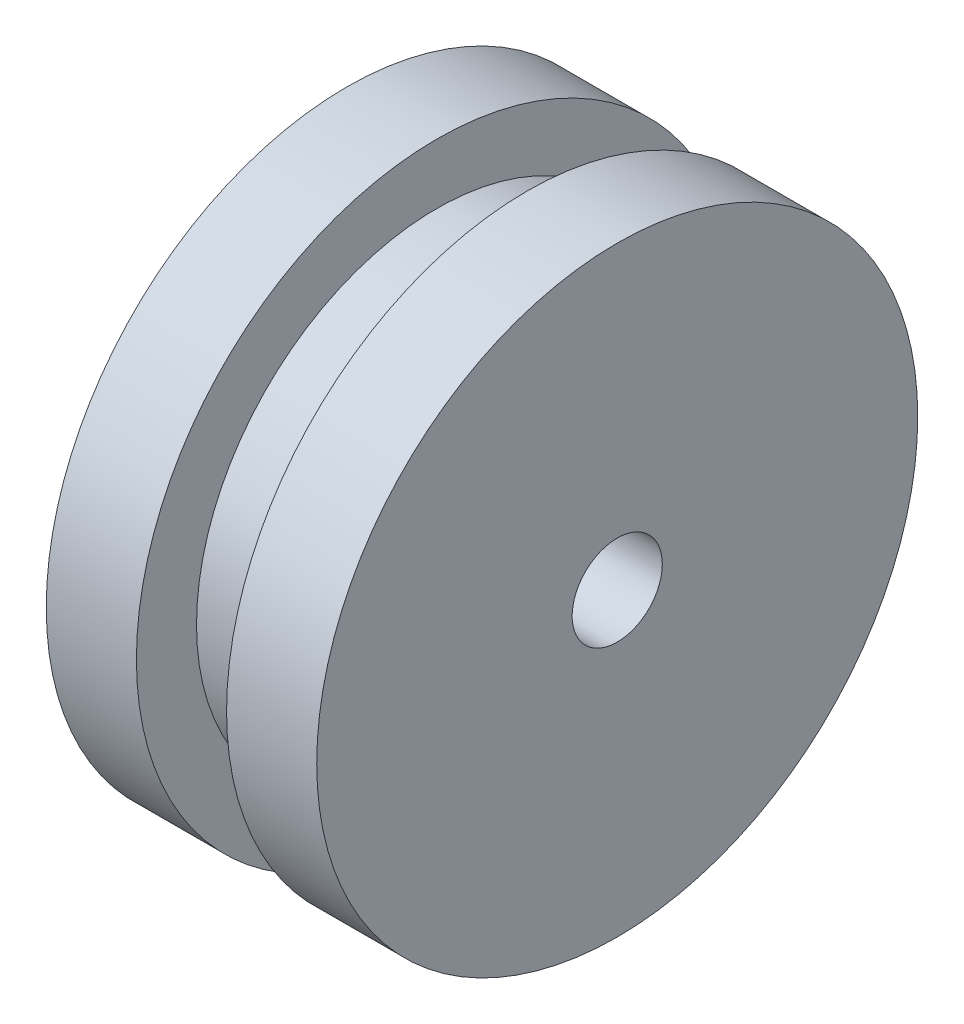
ISO-10303-21;
HEADER;
FILE_DESCRIPTION(('STEP AP214'),'2;1');
FILE_NAME('part.step','',(''),(''),'','','');
FILE_SCHEMA(('AUTOMOTIVE_DESIGN { 1 0 10303 214 1 1 1 1 }'));
ENDSEC;
DATA;
#1=APPLICATION_CONTEXT('core data for automotive mechanical design processes');
#2=APPLICATION_PROTOCOL_DEFINITION('international standard','automotive_design',2000,#1);
#3=PRODUCT_CONTEXT('',#1,'mechanical');
#4=PRODUCT('Part','Part','',(#3));
#5=PRODUCT_RELATED_PRODUCT_CATEGORY('part','',(#4));
#6=PRODUCT_DEFINITION_FORMATION('','',#4);
#7=PRODUCT_DEFINITION_CONTEXT('part definition',#1,'design');
#8=PRODUCT_DEFINITION('design','',#6,#7);
#9=PRODUCT_DEFINITION_SHAPE('','',#8);
#10=(LENGTH_UNIT() NAMED_UNIT(*) SI_UNIT(.MILLI.,.METRE.));
#11=(NAMED_UNIT(*) PLANE_ANGLE_UNIT() SI_UNIT($,.RADIAN.));
#12=(NAMED_UNIT(*) SI_UNIT($,.STERADIAN.) SOLID_ANGLE_UNIT());
#13=UNCERTAINTY_MEASURE_WITH_UNIT(LENGTH_MEASURE(1.E-05),#10,'distance_accuracy_value','');
#14=(GEOMETRIC_REPRESENTATION_CONTEXT(3) GLOBAL_UNCERTAINTY_ASSIGNED_CONTEXT((#13)) GLOBAL_UNIT_ASSIGNED_CONTEXT((#10,
#11,#12)) REPRESENTATION_CONTEXT('',''));
#15=CARTESIAN_POINT('',(0.,0.,0.));
#16=DIRECTION('',(0.,0.,1.));
#17=DIRECTION('',(1.,0.,0.));
#18=AXIS2_PLACEMENT_3D('',#15,#16,#17);
#19=CARTESIAN_POINT('',(14.2875,0.,0.));
#20=DIRECTION('',(-1.,0.,0.));
#21=DIRECTION('',(0.,0.,1.));
#22=AXIS2_PLACEMENT_3D('',#19,#20,#21);
#23=CYLINDRICAL_SURFACE('',#22,15.875);
#24=CARTESIAN_POINT('',(14.2875,0.,0.));
#25=DIRECTION('',(1.,0.,0.));
#26=DIRECTION('',(0.,0.,-1.));
#27=AXIS2_PLACEMENT_3D('',#24,#25,#26);
#28=CIRCLE('',#27,15.875);
#29=CARTESIAN_POINT('',(14.2875,0.,15.875));
#30=VERTEX_POINT('',#29);
#31=EDGE_CURVE('E11',#30,#30,#28,.T.);
#32=CARTESIAN_POINT('',(9.525,0.,0.));
#33=DIRECTION('',(1.,0.,0.));
#34=DIRECTION('',(0.,0.,-1.));
#35=AXIS2_PLACEMENT_3D('',#32,#33,#34);
#36=CIRCLE('',#35,15.875);
#37=CARTESIAN_POINT('',(9.525,0.,15.875));
#38=VERTEX_POINT('',#37);
#39=EDGE_CURVE('E47',#38,#38,#36,.T.);
#40=CARTESIAN_POINT('',(14.2875,0.,15.875));
#41=CARTESIAN_POINT('',(14.237890625,0.,15.875));
#42=CARTESIAN_POINT('',(14.18828125,0.,15.875));
#43=CARTESIAN_POINT('',(14.0890625,0.,15.875));
#44=CARTESIAN_POINT('',(14.039453125,0.,15.875));
#45=CARTESIAN_POINT('',(13.940234375,0.,15.875));
#46=CARTESIAN_POINT('',(13.890625,0.,15.875));
#47=CARTESIAN_POINT('',(13.79140625,0.,15.875));
#48=CARTESIAN_POINT('',(13.741796875,0.,15.875));
#49=CARTESIAN_POINT('',(13.642578125,0.,15.875));
#50=CARTESIAN_POINT('',(13.59296875,0.,15.875));
#51=CARTESIAN_POINT('',(13.49375,0.,15.875));
#52=CARTESIAN_POINT('',(13.444140625,0.,15.875));
#53=CARTESIAN_POINT('',(13.344921875,0.,15.875));
#54=CARTESIAN_POINT('',(13.2953125,0.,15.875));
#55=CARTESIAN_POINT('',(13.19609375,0.,15.875));
#56=CARTESIAN_POINT('',(13.146484375,0.,15.875));
#57=CARTESIAN_POINT('',(13.047265625,0.,15.875));
#58=CARTESIAN_POINT('',(12.99765625,0.,15.875));
#59=CARTESIAN_POINT('',(12.8984375,0.,15.875));
#60=CARTESIAN_POINT('',(12.848828125,0.,15.875));
#61=CARTESIAN_POINT('',(12.749609375,0.,15.875));
#62=CARTESIAN_POINT('',(12.7,0.,15.875));
#63=CARTESIAN_POINT('',(12.60078125,0.,15.875));
#64=CARTESIAN_POINT('',(12.551171875,0.,15.875));
#65=CARTESIAN_POINT('',(12.451953125,0.,15.875));
#66=CARTESIAN_POINT('',(12.40234375,0.,15.875));
#67=CARTESIAN_POINT('',(12.303125,0.,15.875));
#68=CARTESIAN_POINT('',(12.253515625,0.,15.875));
#69=CARTESIAN_POINT('',(12.154296875,0.,15.875));
#70=CARTESIAN_POINT('',(12.1046875,0.,15.875));
#71=CARTESIAN_POINT('',(12.00546875,0.,15.875));
#72=CARTESIAN_POINT('',(11.955859375,0.,15.875));
#73=CARTESIAN_POINT('',(11.856640625,0.,15.875));
#74=CARTESIAN_POINT('',(11.80703125,0.,15.875));
#75=CARTESIAN_POINT('',(11.7078125,0.,15.875));
#76=CARTESIAN_POINT('',(11.658203125,0.,15.875));
#77=CARTESIAN_POINT('',(11.558984375,0.,15.875));
#78=CARTESIAN_POINT('',(11.509375,0.,15.875));
#79=CARTESIAN_POINT('',(11.41015625,0.,15.875));
#80=CARTESIAN_POINT('',(11.360546875,0.,15.875));
#81=CARTESIAN_POINT('',(11.261328125,0.,15.875));
#82=CARTESIAN_POINT('',(11.21171875,0.,15.875));
#83=CARTESIAN_POINT('',(11.1125,0.,15.875));
#84=CARTESIAN_POINT('',(11.062890625,0.,15.875));
#85=CARTESIAN_POINT('',(10.963671875,0.,15.875));
#86=CARTESIAN_POINT('',(10.9140625,0.,15.875));
#87=CARTESIAN_POINT('',(10.81484375,0.,15.875));
#88=CARTESIAN_POINT('',(10.765234375,0.,15.875));
#89=CARTESIAN_POINT('',(10.666015625,0.,15.875));
#90=CARTESIAN_POINT('',(10.61640625,0.,15.875));
#91=CARTESIAN_POINT('',(10.5171875,0.,15.875));
#92=CARTESIAN_POINT('',(10.467578125,0.,15.875));
#93=CARTESIAN_POINT('',(10.368359375,0.,15.875));
#94=CARTESIAN_POINT('',(10.31875,0.,15.875));
#95=CARTESIAN_POINT('',(10.21953125,0.,15.875));
#96=CARTESIAN_POINT('',(10.169921875,0.,15.875));
#97=CARTESIAN_POINT('',(10.070703125,0.,15.875));
#98=CARTESIAN_POINT('',(10.02109375,0.,15.875));
#99=CARTESIAN_POINT('',(9.921875,0.,15.875));
#100=CARTESIAN_POINT('',(9.872265625,0.,15.875));
#101=CARTESIAN_POINT('',(9.773046875,0.,15.875));
#102=CARTESIAN_POINT('',(9.7234375,0.,15.875));
#103=CARTESIAN_POINT('',(9.62421875,0.,15.875));
#104=CARTESIAN_POINT('',(9.574609375,0.,15.875));
#105=CARTESIAN_POINT('',(9.525,0.,15.875));
#106=B_SPLINE_CURVE_WITH_KNOTS('',3,(#40,#41,#42,#43,#44,#45,#46,#47,#48,#49,#50,#51,#52,#53,
#54,#55,#56,#57,#58,#59,#60,#61,#62,#63,#64,#65,#66,#67,#68,#69,#70,#71,#72,#73,#74,#75,#76,#77,
#78,#79,#80,#81,#82,#83,#84,#85,#86,#87,#88,#89,#90,#91,#92,#93,#94,#95,#96,#97,#98,#99,#100,
#101,#102,#103,#104,#105),.UNSPECIFIED.,.F.,.F.,(4,2,2,2,2,2,2,2,2,2,2,2,2,2,2,2,2,2,2,2,2,2,2,
2,2,2,2,2,2,2,2,2,4),(0.,0.148828125,0.29765625,0.446484375,0.5953125,0.744140625,
0.892968750000001,1.041796875,1.190625,1.339453125,1.48828125,1.637109375,1.7859375,1.934765625,
2.08359375,2.232421875,2.38125,2.530078125,2.67890625,2.827734375,2.9765625,3.125390625,
3.27421875,3.423046875,3.571875,3.720703125,3.86953125,4.018359375,4.1671875,4.316015625,
4.46484375,4.613671875,4.7625),.UNSPECIFIED.);
#107=EDGE_CURVE('BSEAM40',#30,#38,#106,.T.);
#108=ORIENTED_EDGE('',*,*,#31,.F.);
#109=ORIENTED_EDGE('',*,*,#39,.T.);
#110=ORIENTED_EDGE('',*,*,#107,.T.);
#111=ORIENTED_EDGE('',*,*,#107,.F.);
#112=EDGE_LOOP('',(#108,#110,#109,#111));
#113=FACE_BOUND('',#112,.T.);
#114=ADVANCED_FACE('F40',(#113),#23,.T.);
#115=CARTESIAN_POINT('',(14.2875,0.,0.));
#116=DIRECTION('',(1.,0.,0.));
#117=DIRECTION('',(0.,0.,-1.));
#118=AXIS2_PLACEMENT_3D('',#115,#116,#117);
#119=PLANE('',#118);
#120=CARTESIAN_POINT('',(14.2875,0.,0.));
#121=DIRECTION('',(1.,0.,0.));
#122=DIRECTION('',(0.,0.,-1.));
#123=AXIS2_PLACEMENT_3D('',#120,#121,#122);
#124=CIRCLE('',#123,2.38125);
#125=CARTESIAN_POINT('',(14.2875,0.,-2.38125));
#126=VERTEX_POINT('',#125);
#127=EDGE_CURVE('E53',#126,#126,#124,.T.);
#128=ORIENTED_EDGE('',*,*,#127,.F.);
#129=EDGE_LOOP('',(#128));
#130=FACE_BOUND('',#129,.T.);
#131=ORIENTED_EDGE('',*,*,#31,.T.);
#132=EDGE_LOOP('',(#131));
#133=FACE_BOUND('',#132,.T.);
#134=ADVANCED_FACE('F69',(#130,#133),#119,.T.);
#135=CARTESIAN_POINT('',(9.525,0.,0.));
#136=DIRECTION('',(1.,0.,0.));
#137=DIRECTION('',(0.,0.,-1.));
#138=AXIS2_PLACEMENT_3D('',#135,#136,#137);
#139=PLANE('',#138);
#140=CARTESIAN_POINT('',(9.525,0.,0.));
#141=DIRECTION('',(1.,0.,0.));
#142=DIRECTION('',(0.,0.,-1.));
#143=AXIS2_PLACEMENT_3D('',#140,#141,#142);
#144=CIRCLE('',#143,2.38125);
#145=CARTESIAN_POINT('',(9.525,0.,-2.38125));
#146=VERTEX_POINT('',#145);
#147=EDGE_CURVE('E43',#146,#146,#144,.T.);
#148=ORIENTED_EDGE('',*,*,#147,.T.);
#149=EDGE_LOOP('',(#148));
#150=FACE_BOUND('',#149,.T.);
#151=ORIENTED_EDGE('',*,*,#39,.F.);
#152=EDGE_LOOP('',(#151));
#153=FACE_BOUND('',#152,.T.);
#154=ADVANCED_FACE('F60',(#150,#153),#139,.F.);
#155=CARTESIAN_POINT('',(0.,0.,0.));
#156=DIRECTION('',(1.,0.,0.));
#157=DIRECTION('',(0.,0.,-1.));
#158=AXIS2_PLACEMENT_3D('',#155,#156,#157);
#159=CYLINDRICAL_SURFACE('',#158,2.38125);
#160=CARTESIAN_POINT('',(14.2875,0.,-2.38125));
#161=CARTESIAN_POINT('',(14.237890625,0.,-2.38125));
#162=CARTESIAN_POINT('',(14.18828125,0.,-2.38125));
#163=CARTESIAN_POINT('',(14.0890625,0.,-2.38125));
#164=CARTESIAN_POINT('',(14.039453125,0.,-2.38125));
#165=CARTESIAN_POINT('',(13.940234375,0.,-2.38125));
#166=CARTESIAN_POINT('',(13.890625,0.,-2.38125));
#167=CARTESIAN_POINT('',(13.79140625,0.,-2.38125));
#168=CARTESIAN_POINT('',(13.741796875,0.,-2.38125));
#169=CARTESIAN_POINT('',(13.642578125,0.,-2.38125));
#170=CARTESIAN_POINT('',(13.59296875,0.,-2.38125));
#171=CARTESIAN_POINT('',(13.49375,0.,-2.38125));
#172=CARTESIAN_POINT('',(13.444140625,0.,-2.38125));
#173=CARTESIAN_POINT('',(13.344921875,0.,-2.38125));
#174=CARTESIAN_POINT('',(13.2953125,0.,-2.38125));
#175=CARTESIAN_POINT('',(13.19609375,0.,-2.38125));
#176=CARTESIAN_POINT('',(13.146484375,0.,-2.38125));
#177=CARTESIAN_POINT('',(13.047265625,0.,-2.38125));
#178=CARTESIAN_POINT('',(12.99765625,0.,-2.38125));
#179=CARTESIAN_POINT('',(12.8984375,0.,-2.38125));
#180=CARTESIAN_POINT('',(12.848828125,0.,-2.38125));
#181=CARTESIAN_POINT('',(12.749609375,0.,-2.38125));
#182=CARTESIAN_POINT('',(12.7,0.,-2.38125));
#183=CARTESIAN_POINT('',(12.60078125,0.,-2.38125));
#184=CARTESIAN_POINT('',(12.551171875,0.,-2.38125));
#185=CARTESIAN_POINT('',(12.451953125,0.,-2.38125));
#186=CARTESIAN_POINT('',(12.40234375,0.,-2.38125));
#187=CARTESIAN_POINT('',(12.303125,0.,-2.38125));
#188=CARTESIAN_POINT('',(12.253515625,0.,-2.38125));
#189=CARTESIAN_POINT('',(12.154296875,0.,-2.38125));
#190=CARTESIAN_POINT('',(12.1046875,0.,-2.38125));
#191=CARTESIAN_POINT('',(12.00546875,0.,-2.38125));
#192=CARTESIAN_POINT('',(11.955859375,0.,-2.38125));
#193=CARTESIAN_POINT('',(11.856640625,0.,-2.38125));
#194=CARTESIAN_POINT('',(11.80703125,0.,-2.38125));
#195=CARTESIAN_POINT('',(11.7078125,0.,-2.38125));
#196=CARTESIAN_POINT('',(11.658203125,0.,-2.38125));
#197=CARTESIAN_POINT('',(11.558984375,0.,-2.38125));
#198=CARTESIAN_POINT('',(11.509375,0.,-2.38125));
#199=CARTESIAN_POINT('',(11.41015625,0.,-2.38125));
#200=CARTESIAN_POINT('',(11.360546875,0.,-2.38125));
#201=CARTESIAN_POINT('',(11.261328125,0.,-2.38125));
#202=CARTESIAN_POINT('',(11.21171875,0.,-2.38125));
#203=CARTESIAN_POINT('',(11.1125,0.,-2.38125));
#204=CARTESIAN_POINT('',(11.062890625,0.,-2.38125));
#205=CARTESIAN_POINT('',(10.963671875,0.,-2.38125));
#206=CARTESIAN_POINT('',(10.9140625,0.,-2.38125));
#207=CARTESIAN_POINT('',(10.81484375,0.,-2.38125));
#208=CARTESIAN_POINT('',(10.765234375,0.,-2.38125));
#209=CARTESIAN_POINT('',(10.666015625,0.,-2.38125));
#210=CARTESIAN_POINT('',(10.61640625,0.,-2.38125));
#211=CARTESIAN_POINT('',(10.5171875,0.,-2.38125));
#212=CARTESIAN_POINT('',(10.467578125,0.,-2.38125));
#213=CARTESIAN_POINT('',(10.368359375,0.,-2.38125));
#214=CARTESIAN_POINT('',(10.31875,0.,-2.38125));
#215=CARTESIAN_POINT('',(10.21953125,0.,-2.38125));
#216=CARTESIAN_POINT('',(10.169921875,0.,-2.38125));
#217=CARTESIAN_POINT('',(10.070703125,0.,-2.38125));
#218=CARTESIAN_POINT('',(10.02109375,0.,-2.38125));
#219=CARTESIAN_POINT('',(9.921875,0.,-2.38125));
#220=CARTESIAN_POINT('',(9.872265625,0.,-2.38125));
#221=CARTESIAN_POINT('',(9.773046875,0.,-2.38125));
#222=CARTESIAN_POINT('',(9.7234375,0.,-2.38125));
#223=CARTESIAN_POINT('',(9.62421875,0.,-2.38125));
#224=CARTESIAN_POINT('',(9.574609375,0.,-2.38125));
#225=CARTESIAN_POINT('',(9.525,0.,-2.38125));
#226=B_SPLINE_CURVE_WITH_KNOTS('',3,(#160,#161,#162,#163,#164,#165,#166,#167,#168,#169,#170,
#171,#172,#173,#174,#175,#176,#177,#178,#179,#180,#181,#182,#183,#184,#185,#186,#187,#188,#189,
#190,#191,#192,#193,#194,#195,#196,#197,#198,#199,#200,#201,#202,#203,#204,#205,#206,#207,#208,
#209,#210,#211,#212,#213,#214,#215,#216,#217,#218,#219,#220,#221,#222,#223,#224,#225),
.UNSPECIFIED.,.F.,.F.,(4,2,2,2,2,2,2,2,2,2,2,2,2,2,2,2,2,2,2,2,2,2,2,2,2,2,2,2,2,2,2,2,4),(0.,
0.148828125,0.29765625,0.446484375,0.5953125,0.744140625,0.892968750000001,1.041796875,1.190625,
1.339453125,1.48828125,1.637109375,1.7859375,1.934765625,2.08359375,2.232421875,2.38125,
2.530078125,2.67890625,2.827734375,2.9765625,3.125390625,3.27421875,3.423046875,3.571875,
3.720703125,3.86953125,4.018359375,4.1671875,4.316015625,4.46484375,4.613671875,4.7625),.UNSPECIFIED.);
#227=EDGE_CURVE('BSEAM63',#126,#146,#226,.T.);
#228=ORIENTED_EDGE('',*,*,#127,.T.);
#229=ORIENTED_EDGE('',*,*,#147,.F.);
#230=ORIENTED_EDGE('',*,*,#227,.T.);
#231=ORIENTED_EDGE('',*,*,#227,.F.);
#232=EDGE_LOOP('',(#228,#230,#229,#231));
#233=FACE_BOUND('',#232,.T.);
#234=ADVANCED_FACE('F63',(#233),#159,.F.);
#235=CLOSED_SHELL('',(#114,#134,#154,#234));
#236=MANIFOLD_SOLID_BREP('B2',#235);
#237=CARTESIAN_POINT('',(9.525,0.,0.));
#238=DIRECTION('',(-1.,0.,0.));
#239=DIRECTION('',(0.,0.,1.));
#240=AXIS2_PLACEMENT_3D('',#237,#238,#239);
#241=CYLINDRICAL_SURFACE('',#240,12.7);
#242=CARTESIAN_POINT('',(9.525,0.,0.));
#243=DIRECTION('',(1.,0.,0.));
#244=DIRECTION('',(0.,0.,-1.));
#245=AXIS2_PLACEMENT_3D('',#242,#243,#244);
#246=CIRCLE('',#245,12.7);
#247=CARTESIAN_POINT('',(9.525,0.,12.7));
#248=VERTEX_POINT('',#247);
#249=EDGE_CURVE('E39',#248,#248,#246,.T.);
#250=CARTESIAN_POINT('',(4.7625,0.,0.));
#251=DIRECTION('',(1.,0.,0.));
#252=DIRECTION('',(0.,0.,-1.));
#253=AXIS2_PLACEMENT_3D('',#250,#251,#252);
#254=CIRCLE('',#253,12.7);
#255=CARTESIAN_POINT('',(4.7625,0.,12.7));
#256=VERTEX_POINT('',#255);
#257=EDGE_CURVE('E116',#256,#256,#254,.T.);
#258=CARTESIAN_POINT('',(9.525,0.,12.7));
#259=CARTESIAN_POINT('',(9.475390625,0.,12.7));
#260=CARTESIAN_POINT('',(9.42578125,0.,12.7));
#261=CARTESIAN_POINT('',(9.3265625,0.,12.7));
#262=CARTESIAN_POINT('',(9.276953125,0.,12.7));
#263=CARTESIAN_POINT('',(9.177734375,0.,12.7));
#264=CARTESIAN_POINT('',(9.128125,0.,12.7));
#265=CARTESIAN_POINT('',(9.02890625,0.,12.7));
#266=CARTESIAN_POINT('',(8.979296875,0.,12.7));
#267=CARTESIAN_POINT('',(8.880078125,0.,12.7));
#268=CARTESIAN_POINT('',(8.83046875,0.,12.7));
#269=CARTESIAN_POINT('',(8.73125,0.,12.7));
#270=CARTESIAN_POINT('',(8.681640625,0.,12.7));
#271=CARTESIAN_POINT('',(8.582421875,0.,12.7));
#272=CARTESIAN_POINT('',(8.5328125,0.,12.7));
#273=CARTESIAN_POINT('',(8.43359375,0.,12.7));
#274=CARTESIAN_POINT('',(8.383984375,0.,12.7));
#275=CARTESIAN_POINT('',(8.284765625,0.,12.7));
#276=CARTESIAN_POINT('',(8.23515625,0.,12.7));
#277=CARTESIAN_POINT('',(8.1359375,0.,12.7));
#278=CARTESIAN_POINT('',(8.086328125,0.,12.7));
#279=CARTESIAN_POINT('',(7.987109375,0.,12.7));
#280=CARTESIAN_POINT('',(7.9375,0.,12.7));
#281=CARTESIAN_POINT('',(7.83828125,0.,12.7));
#282=CARTESIAN_POINT('',(7.788671875,0.,12.7));
#283=CARTESIAN_POINT('',(7.689453125,0.,12.7));
#284=CARTESIAN_POINT('',(7.63984375,0.,12.7));
#285=CARTESIAN_POINT('',(7.540625,0.,12.7));
#286=CARTESIAN_POINT('',(7.491015625,0.,12.7));
#287=CARTESIAN_POINT('',(7.391796875,0.,12.7));
#288=CARTESIAN_POINT('',(7.3421875,0.,12.7));
#289=CARTESIAN_POINT('',(7.24296875,0.,12.7));
#290=CARTESIAN_POINT('',(7.193359375,0.,12.7));
#291=CARTESIAN_POINT('',(7.094140625,0.,12.7));
#292=CARTESIAN_POINT('',(7.04453125,0.,12.7));
#293=CARTESIAN_POINT('',(6.9453125,0.,12.7));
#294=CARTESIAN_POINT('',(6.895703125,0.,12.7));
#295=CARTESIAN_POINT('',(6.796484375,0.,12.7));
#296=CARTESIAN_POINT('',(6.746875,0.,12.7));
#297=CARTESIAN_POINT('',(6.64765625,0.,12.7));
#298=CARTESIAN_POINT('',(6.598046875,0.,12.7));
#299=CARTESIAN_POINT('',(6.498828125,0.,12.7));
#300=CARTESIAN_POINT('',(6.44921875,0.,12.7));
#301=CARTESIAN_POINT('',(6.35,0.,12.7));
#302=CARTESIAN_POINT('',(6.300390625,0.,12.7));
#303=CARTESIAN_POINT('',(6.201171875,0.,12.7));
#304=CARTESIAN_POINT('',(6.1515625,0.,12.7));
#305=CARTESIAN_POINT('',(6.05234375,0.,12.7));
#306=CARTESIAN_POINT('',(6.002734375,0.,12.7));
#307=CARTESIAN_POINT('',(5.903515625,0.,12.7));
#308=CARTESIAN_POINT('',(5.85390625,0.,12.7));
#309=CARTESIAN_POINT('',(5.7546875,0.,12.7));
#310=CARTESIAN_POINT('',(5.705078125,0.,12.7));
#311=CARTESIAN_POINT('',(5.605859375,0.,12.7));
#312=CARTESIAN_POINT('',(5.55625,0.,12.7));
#313=CARTESIAN_POINT('',(5.45703125,0.,12.7));
#314=CARTESIAN_POINT('',(5.407421875,0.,12.7));
#315=CARTESIAN_POINT('',(5.308203125,0.,12.7));
#316=CARTESIAN_POINT('',(5.25859375,0.,12.7));
#317=CARTESIAN_POINT('',(5.159375,0.,12.7));
#318=CARTESIAN_POINT('',(5.109765625,0.,12.7));
#319=CARTESIAN_POINT('',(5.010546875,0.,12.7));
#320=CARTESIAN_POINT('',(4.9609375,0.,12.7));
#321=CARTESIAN_POINT('',(4.86171875,0.,12.7));
#322=CARTESIAN_POINT('',(4.812109375,0.,12.7));
#323=CARTESIAN_POINT('',(4.7625,0.,12.7));
#324=B_SPLINE_CURVE_WITH_KNOTS('',3,(#258,#259,#260,#261,#262,#263,#264,#265,#266,#267,#268,
#269,#270,#271,#272,#273,#274,#275,#276,#277,#278,#279,#280,#281,#282,#283,#284,#285,#286,#287,
#288,#289,#290,#291,#292,#293,#294,#295,#296,#297,#298,#299,#300,#301,#302,#303,#304,#305,#306,
#307,#308,#309,#310,#311,#312,#313,#314,#315,#316,#317,#318,#319,#320,#321,#322,#323),
.UNSPECIFIED.,.F.,.F.,(4,2,2,2,2,2,2,2,2,2,2,2,2,2,2,2,2,2,2,2,2,2,2,2,2,2,2,2,2,2,2,2,4),(0.,
0.148828124999998,0.297656249999998,0.446484374999999,0.595312499999999,0.744140624999999,
0.892968749999999,1.041796875,1.190625,1.339453125,1.48828125,1.637109375,1.7859375,1.934765625,
2.08359375,2.232421875,2.38125,2.530078125,2.67890625,2.827734375,2.9765625,3.125390625,
3.27421875,3.423046875,3.571875,3.720703125,3.86953125,4.018359375,4.1671875,4.316015625,
4.46484375,4.613671875,4.7625),.UNSPECIFIED.);
#325=EDGE_CURVE('BSEAM109',#248,#256,#324,.T.);
#326=ORIENTED_EDGE('',*,*,#249,.F.);
#327=ORIENTED_EDGE('',*,*,#257,.T.);
#328=ORIENTED_EDGE('',*,*,#325,.T.);
#329=ORIENTED_EDGE('',*,*,#325,.F.);
#330=EDGE_LOOP('',(#326,#328,#327,#329));
#331=FACE_BOUND('',#330,.T.);
#332=ADVANCED_FACE('F109',(#331),#241,.T.);
#333=CARTESIAN_POINT('',(9.525,0.,0.));
#334=DIRECTION('',(1.,0.,0.));
#335=DIRECTION('',(0.,0.,-1.));
#336=AXIS2_PLACEMENT_3D('',#333,#334,#335);
#337=PLANE('',#336);
#338=CARTESIAN_POINT('',(9.525,0.,0.));
#339=DIRECTION('',(1.,0.,0.));
#340=DIRECTION('',(0.,0.,-1.));
#341=AXIS2_PLACEMENT_3D('',#338,#339,#340);
#342=CIRCLE('',#341,2.38125);
#343=CARTESIAN_POINT('',(9.525,0.,-2.38125));
#344=VERTEX_POINT('',#343);
#345=EDGE_CURVE('E121',#344,#344,#342,.T.);
#346=ORIENTED_EDGE('',*,*,#345,.F.);
#347=EDGE_LOOP('',(#346));
#348=FACE_BOUND('',#347,.T.);
#349=ORIENTED_EDGE('',*,*,#249,.T.);
#350=EDGE_LOOP('',(#349));
#351=FACE_BOUND('',#350,.T.);
#352=ADVANCED_FACE('F138',(#348,#351),#337,.T.);
#353=CARTESIAN_POINT('',(4.7625,0.,0.));
#354=DIRECTION('',(1.,0.,0.));
#355=DIRECTION('',(0.,0.,-1.));
#356=AXIS2_PLACEMENT_3D('',#353,#354,#355);
#357=PLANE('',#356);
#358=CARTESIAN_POINT('',(4.7625,0.,0.));
#359=DIRECTION('',(1.,0.,0.));
#360=DIRECTION('',(0.,0.,-1.));
#361=AXIS2_PLACEMENT_3D('',#358,#359,#360);
#362=CIRCLE('',#361,2.38125);
#363=CARTESIAN_POINT('',(4.7625,0.,-2.38125));
#364=VERTEX_POINT('',#363);
#365=EDGE_CURVE('E112',#364,#364,#362,.T.);
#366=ORIENTED_EDGE('',*,*,#365,.T.);
#367=EDGE_LOOP('',(#366));
#368=FACE_BOUND('',#367,.T.);
#369=ORIENTED_EDGE('',*,*,#257,.F.);
#370=EDGE_LOOP('',(#369));
#371=FACE_BOUND('',#370,.T.);
#372=ADVANCED_FACE('F129',(#368,#371),#357,.F.);
#373=CARTESIAN_POINT('',(0.,0.,0.));
#374=DIRECTION('',(1.,0.,0.));
#375=DIRECTION('',(0.,0.,-1.));
#376=AXIS2_PLACEMENT_3D('',#373,#374,#375);
#377=CYLINDRICAL_SURFACE('',#376,2.38125);
#378=CARTESIAN_POINT('',(9.525,0.,-2.38125));
#379=CARTESIAN_POINT('',(9.475390625,0.,-2.38125));
#380=CARTESIAN_POINT('',(9.42578125,0.,-2.38125));
#381=CARTESIAN_POINT('',(9.3265625,0.,-2.38125));
#382=CARTESIAN_POINT('',(9.276953125,0.,-2.38125));
#383=CARTESIAN_POINT('',(9.177734375,0.,-2.38125));
#384=CARTESIAN_POINT('',(9.128125,0.,-2.38125));
#385=CARTESIAN_POINT('',(9.02890625,0.,-2.38125));
#386=CARTESIAN_POINT('',(8.979296875,0.,-2.38125));
#387=CARTESIAN_POINT('',(8.880078125,0.,-2.38125));
#388=CARTESIAN_POINT('',(8.83046875,0.,-2.38125));
#389=CARTESIAN_POINT('',(8.73125,0.,-2.38125));
#390=CARTESIAN_POINT('',(8.681640625,0.,-2.38125));
#391=CARTESIAN_POINT('',(8.582421875,0.,-2.38125));
#392=CARTESIAN_POINT('',(8.5328125,0.,-2.38125));
#393=CARTESIAN_POINT('',(8.43359375,0.,-2.38125));
#394=CARTESIAN_POINT('',(8.383984375,0.,-2.38125));
#395=CARTESIAN_POINT('',(8.284765625,0.,-2.38125));
#396=CARTESIAN_POINT('',(8.23515625,0.,-2.38125));
#397=CARTESIAN_POINT('',(8.1359375,0.,-2.38125));
#398=CARTESIAN_POINT('',(8.086328125,0.,-2.38125));
#399=CARTESIAN_POINT('',(7.987109375,0.,-2.38125));
#400=CARTESIAN_POINT('',(7.9375,0.,-2.38125));
#401=CARTESIAN_POINT('',(7.83828125,0.,-2.38125));
#402=CARTESIAN_POINT('',(7.788671875,0.,-2.38125));
#403=CARTESIAN_POINT('',(7.689453125,0.,-2.38125));
#404=CARTESIAN_POINT('',(7.63984375,0.,-2.38125));
#405=CARTESIAN_POINT('',(7.540625,0.,-2.38125));
#406=CARTESIAN_POINT('',(7.491015625,0.,-2.38125));
#407=CARTESIAN_POINT('',(7.391796875,0.,-2.38125));
#408=CARTESIAN_POINT('',(7.3421875,0.,-2.38125));
#409=CARTESIAN_POINT('',(7.24296875,0.,-2.38125));
#410=CARTESIAN_POINT('',(7.193359375,0.,-2.38125));
#411=CARTESIAN_POINT('',(7.094140625,0.,-2.38125));
#412=CARTESIAN_POINT('',(7.04453125,0.,-2.38125));
#413=CARTESIAN_POINT('',(6.9453125,0.,-2.38125));
#414=CARTESIAN_POINT('',(6.895703125,0.,-2.38125));
#415=CARTESIAN_POINT('',(6.796484375,0.,-2.38125));
#416=CARTESIAN_POINT('',(6.746875,0.,-2.38125));
#417=CARTESIAN_POINT('',(6.64765625,0.,-2.38125));
#418=CARTESIAN_POINT('',(6.598046875,0.,-2.38125));
#419=CARTESIAN_POINT('',(6.498828125,0.,-2.38125));
#420=CARTESIAN_POINT('',(6.44921875,0.,-2.38125));
#421=CARTESIAN_POINT('',(6.35,0.,-2.38125));
#422=CARTESIAN_POINT('',(6.300390625,0.,-2.38125));
#423=CARTESIAN_POINT('',(6.201171875,0.,-2.38125));
#424=CARTESIAN_POINT('',(6.1515625,0.,-2.38125));
#425=CARTESIAN_POINT('',(6.05234375,0.,-2.38125));
#426=CARTESIAN_POINT('',(6.002734375,0.,-2.38125));
#427=CARTESIAN_POINT('',(5.903515625,0.,-2.38125));
#428=CARTESIAN_POINT('',(5.85390625,0.,-2.38125));
#429=CARTESIAN_POINT('',(5.7546875,0.,-2.38125));
#430=CARTESIAN_POINT('',(5.705078125,0.,-2.38125));
#431=CARTESIAN_POINT('',(5.605859375,0.,-2.38125));
#432=CARTESIAN_POINT('',(5.55625,0.,-2.38125));
#433=CARTESIAN_POINT('',(5.45703125,0.,-2.38125));
#434=CARTESIAN_POINT('',(5.407421875,0.,-2.38125));
#435=CARTESIAN_POINT('',(5.308203125,0.,-2.38125));
#436=CARTESIAN_POINT('',(5.25859375,0.,-2.38125));
#437=CARTESIAN_POINT('',(5.159375,0.,-2.38125));
#438=CARTESIAN_POINT('',(5.109765625,0.,-2.38125));
#439=CARTESIAN_POINT('',(5.010546875,0.,-2.38125));
#440=CARTESIAN_POINT('',(4.9609375,0.,-2.38125));
#441=CARTESIAN_POINT('',(4.86171875,0.,-2.38125));
#442=CARTESIAN_POINT('',(4.812109375,0.,-2.38125));
#443=CARTESIAN_POINT('',(4.7625,0.,-2.38125));
#444=B_SPLINE_CURVE_WITH_KNOTS('',3,(#378,#379,#380,#381,#382,#383,#384,#385,#386,#387,#388,
#389,#390,#391,#392,#393,#394,#395,#396,#397,#398,#399,#400,#401,#402,#403,#404,#405,#406,#407,
#408,#409,#410,#411,#412,#413,#414,#415,#416,#417,#418,#419,#420,#421,#422,#423,#424,#425,#426,
#427,#428,#429,#430,#431,#432,#433,#434,#435,#436,#437,#438,#439,#440,#441,#442,#443),
.UNSPECIFIED.,.F.,.F.,(4,2,2,2,2,2,2,2,2,2,2,2,2,2,2,2,2,2,2,2,2,2,2,2,2,2,2,2,2,2,2,2,4),(0.,
0.148828125,0.29765625,0.446484375,0.5953125,0.744140625,0.892968750000001,1.041796875,1.190625,
1.339453125,1.48828125,1.637109375,1.7859375,1.934765625,2.08359375,2.232421875,2.38125,
2.530078125,2.67890625,2.827734375,2.9765625,3.125390625,3.27421875,3.423046875,3.571875,
3.720703125,3.86953125,4.018359375,4.1671875,4.316015625,4.46484375,4.613671875,4.7625),.UNSPECIFIED.);
#445=EDGE_CURVE('BSEAM132',#344,#364,#444,.T.);
#446=ORIENTED_EDGE('',*,*,#345,.T.);
#447=ORIENTED_EDGE('',*,*,#365,.F.);
#448=ORIENTED_EDGE('',*,*,#445,.T.);
#449=ORIENTED_EDGE('',*,*,#445,.F.);
#450=EDGE_LOOP('',(#446,#448,#447,#449));
#451=FACE_BOUND('',#450,.T.);
#452=ADVANCED_FACE('F132',(#451),#377,.F.);
#453=CLOSED_SHELL('',(#332,#352,#372,#452));
#454=MANIFOLD_SOLID_BREP('B6',#453);
#455=CARTESIAN_POINT('',(4.7625,0.,0.));
#456=DIRECTION('',(-1.,0.,0.));
#457=DIRECTION('',(0.,0.,1.));
#458=AXIS2_PLACEMENT_3D('',#455,#456,#457);
#459=CYLINDRICAL_SURFACE('',#458,15.875);
#460=CARTESIAN_POINT('',(4.7625,0.,0.));
#461=DIRECTION('',(1.,0.,0.));
#462=DIRECTION('',(0.,0.,-1.));
#463=AXIS2_PLACEMENT_3D('',#460,#461,#462);
#464=CIRCLE('',#463,15.875);
#465=CARTESIAN_POINT('',(4.7625,0.,15.875));
#466=VERTEX_POINT('',#465);
#467=EDGE_CURVE('E108',#466,#466,#464,.T.);
#468=CARTESIAN_POINT('',(0.,0.,0.));
#469=DIRECTION('',(1.,0.,0.));
#470=DIRECTION('',(0.,0.,-1.));
#471=AXIS2_PLACEMENT_3D('',#468,#469,#470);
#472=CIRCLE('',#471,15.875);
#473=CARTESIAN_POINT('',(0.,0.,15.875));
#474=VERTEX_POINT('',#473);
#475=EDGE_CURVE('E174',#474,#474,#472,.T.);
#476=CARTESIAN_POINT('',(4.7625,0.,15.875));
#477=CARTESIAN_POINT('',(4.712890625,0.,15.875));
#478=CARTESIAN_POINT('',(4.66328125,0.,15.875));
#479=CARTESIAN_POINT('',(4.5640625,0.,15.875));
#480=CARTESIAN_POINT('',(4.514453125,0.,15.875));
#481=CARTESIAN_POINT('',(4.415234375,0.,15.875));
#482=CARTESIAN_POINT('',(4.365625,0.,15.875));
#483=CARTESIAN_POINT('',(4.26640625,0.,15.875));
#484=CARTESIAN_POINT('',(4.216796875,0.,15.875));
#485=CARTESIAN_POINT('',(4.117578125,0.,15.875));
#486=CARTESIAN_POINT('',(4.06796875,0.,15.875));
#487=CARTESIAN_POINT('',(3.96875,0.,15.875));
#488=CARTESIAN_POINT('',(3.919140625,0.,15.875));
#489=CARTESIAN_POINT('',(3.819921875,0.,15.875));
#490=CARTESIAN_POINT('',(3.7703125,0.,15.875));
#491=CARTESIAN_POINT('',(3.67109375,0.,15.875));
#492=CARTESIAN_POINT('',(3.621484375,0.,15.875));
#493=CARTESIAN_POINT('',(3.522265625,0.,15.875));
#494=CARTESIAN_POINT('',(3.47265625,0.,15.875));
#495=CARTESIAN_POINT('',(3.3734375,0.,15.875));
#496=CARTESIAN_POINT('',(3.323828125,0.,15.875));
#497=CARTESIAN_POINT('',(3.224609375,0.,15.875));
#498=CARTESIAN_POINT('',(3.175,0.,15.875));
#499=CARTESIAN_POINT('',(3.07578125,0.,15.875));
#500=CARTESIAN_POINT('',(3.026171875,0.,15.875));
#501=CARTESIAN_POINT('',(2.926953125,0.,15.875));
#502=CARTESIAN_POINT('',(2.87734375,0.,15.875));
#503=CARTESIAN_POINT('',(2.778125,0.,15.875));
#504=CARTESIAN_POINT('',(2.728515625,0.,15.875));
#505=CARTESIAN_POINT('',(2.629296875,0.,15.875));
#506=CARTESIAN_POINT('',(2.5796875,0.,15.875));
#507=CARTESIAN_POINT('',(2.48046875,0.,15.875));
#508=CARTESIAN_POINT('',(2.430859375,0.,15.875));
#509=CARTESIAN_POINT('',(2.331640625,0.,15.875));
#510=CARTESIAN_POINT('',(2.28203125,0.,15.875));
#511=CARTESIAN_POINT('',(2.1828125,0.,15.875));
#512=CARTESIAN_POINT('',(2.133203125,0.,15.875));
#513=CARTESIAN_POINT('',(2.033984375,0.,15.875));
#514=CARTESIAN_POINT('',(1.984375,0.,15.875));
#515=CARTESIAN_POINT('',(1.88515625,0.,15.875));
#516=CARTESIAN_POINT('',(1.835546875,0.,15.875));
#517=CARTESIAN_POINT('',(1.736328125,0.,15.875));
#518=CARTESIAN_POINT('',(1.68671875,0.,15.875));
#519=CARTESIAN_POINT('',(1.5875,0.,15.875));
#520=CARTESIAN_POINT('',(1.537890625,0.,15.875));
#521=CARTESIAN_POINT('',(1.438671875,0.,15.875));
#522=CARTESIAN_POINT('',(1.3890625,0.,15.875));
#523=CARTESIAN_POINT('',(1.28984375,0.,15.875));
#524=CARTESIAN_POINT('',(1.240234375,0.,15.875));
#525=CARTESIAN_POINT('',(1.141015625,0.,15.875));
#526=CARTESIAN_POINT('',(1.09140625,0.,15.875));
#527=CARTESIAN_POINT('',(0.992187499999999,0.,15.875));
#528=CARTESIAN_POINT('',(0.942578124999999,0.,15.875));
#529=CARTESIAN_POINT('',(0.843359375,0.,15.875));
#530=CARTESIAN_POINT('',(0.79375,0.,15.875));
#531=CARTESIAN_POINT('',(0.69453125,0.,15.875));
#532=CARTESIAN_POINT('',(0.644921875,0.,15.875));
#533=CARTESIAN_POINT('',(0.545703125,0.,15.875));
#534=CARTESIAN_POINT('',(0.49609375,0.,15.875));
#535=CARTESIAN_POINT('',(0.396875,0.,15.875));
#536=CARTESIAN_POINT('',(0.347265625,0.,15.875));
#537=CARTESIAN_POINT('',(0.248046875,0.,15.875));
#538=CARTESIAN_POINT('',(0.1984375,0.,15.875));
#539=CARTESIAN_POINT('',(0.09921875,0.,15.875));
#540=CARTESIAN_POINT('',(0.049609375,0.,15.875));
#541=CARTESIAN_POINT('',(0.,0.,15.875));
#542=B_SPLINE_CURVE_WITH_KNOTS('',3,(#476,#477,#478,#479,#480,#481,#482,#483,#484,#485,#486,
#487,#488,#489,#490,#491,#492,#493,#494,#495,#496,#497,#498,#499,#500,#501,#502,#503,#504,#505,
#506,#507,#508,#509,#510,#511,#512,#513,#514,#515,#516,#517,#518,#519,#520,#521,#522,#523,#524,
#525,#526,#527,#528,#529,#530,#531,#532,#533,#534,#535,#536,#537,#538,#539,#540,#541),
.UNSPECIFIED.,.F.,.F.,(4,2,2,2,2,2,2,2,2,2,2,2,2,2,2,2,2,2,2,2,2,2,2,2,2,2,2,2,2,2,2,2,4),(0.,
0.148828125,0.29765625,0.446484375,0.5953125,0.744140625,0.892968750000001,1.041796875,1.190625,
1.339453125,1.48828125,1.637109375,1.7859375,1.934765625,2.08359375,2.232421875,2.38125,
2.530078125,2.67890625,2.827734375,2.9765625,3.125390625,3.27421875,3.423046875,3.571875,
3.720703125,3.86953125,4.018359375,4.1671875,4.316015625,4.46484375,4.613671875,4.7625),.UNSPECIFIED.);
#543=EDGE_CURVE('BSEAM171',#466,#474,#542,.T.);
#544=ORIENTED_EDGE('',*,*,#467,.F.);
#545=ORIENTED_EDGE('',*,*,#475,.T.);
#546=ORIENTED_EDGE('',*,*,#543,.T.);
#547=ORIENTED_EDGE('',*,*,#543,.F.);
#548=EDGE_LOOP('',(#544,#546,#545,#547));
#549=FACE_BOUND('',#548,.T.);
#550=ADVANCED_FACE('F171',(#549),#459,.T.);
#551=CARTESIAN_POINT('',(4.7625,0.,0.));
#552=DIRECTION('',(1.,0.,0.));
#553=DIRECTION('',(0.,0.,-1.));
#554=AXIS2_PLACEMENT_3D('',#551,#552,#553);
#555=PLANE('',#554);
#556=CARTESIAN_POINT('',(4.7625,0.,0.));
#557=DIRECTION('',(1.,0.,0.));
#558=DIRECTION('',(0.,0.,-1.));
#559=AXIS2_PLACEMENT_3D('',#556,#557,#558);
#560=CIRCLE('',#559,2.38125);
#561=CARTESIAN_POINT('',(4.7625,0.,-2.38125));
#562=VERTEX_POINT('',#561);
#563=EDGE_CURVE('E181',#562,#562,#560,.T.);
#564=ORIENTED_EDGE('',*,*,#563,.F.);
#565=EDGE_LOOP('',(#564));
#566=FACE_BOUND('',#565,.T.);
#567=ORIENTED_EDGE('',*,*,#467,.T.);
#568=EDGE_LOOP('',(#567));
#569=FACE_BOUND('',#568,.T.);
#570=ADVANCED_FACE('F199',(#566,#569),#555,.T.);
#571=CARTESIAN_POINT('',(0.,0.,0.));
#572=DIRECTION('',(1.,0.,0.));
#573=DIRECTION('',(0.,0.,-1.));
#574=AXIS2_PLACEMENT_3D('',#571,#572,#573);
#575=PLANE('',#574);
#576=CARTESIAN_POINT('',(0.,0.,0.));
#577=DIRECTION('',(1.,0.,0.));
#578=DIRECTION('',(0.,0.,-1.));
#579=AXIS2_PLACEMENT_3D('',#576,#577,#578);
#580=CIRCLE('',#579,2.38125);
#581=CARTESIAN_POINT('',(0.,0.,-2.38125));
#582=VERTEX_POINT('',#581);
#583=EDGE_CURVE('E185',#582,#582,#580,.T.);
#584=ORIENTED_EDGE('',*,*,#583,.T.);
#585=EDGE_LOOP('',(#584));
#586=FACE_BOUND('',#585,.T.);
#587=ORIENTED_EDGE('',*,*,#475,.F.);
#588=EDGE_LOOP('',(#587));
#589=FACE_BOUND('',#588,.T.);
#590=ADVANCED_FACE('F189',(#586,#589),#575,.F.);
#591=CARTESIAN_POINT('',(0.,0.,0.));
#592=DIRECTION('',(1.,0.,0.));
#593=DIRECTION('',(0.,0.,-1.));
#594=AXIS2_PLACEMENT_3D('',#591,#592,#593);
#595=CYLINDRICAL_SURFACE('',#594,2.38125);
#596=CARTESIAN_POINT('',(4.7625,0.,-2.38125));
#597=CARTESIAN_POINT('',(4.712890625,0.,-2.38125));
#598=CARTESIAN_POINT('',(4.66328125,0.,-2.38125));
#599=CARTESIAN_POINT('',(4.5640625,0.,-2.38125));
#600=CARTESIAN_POINT('',(4.514453125,0.,-2.38125));
#601=CARTESIAN_POINT('',(4.415234375,0.,-2.38125));
#602=CARTESIAN_POINT('',(4.365625,0.,-2.38125));
#603=CARTESIAN_POINT('',(4.26640625,0.,-2.38125));
#604=CARTESIAN_POINT('',(4.216796875,0.,-2.38125));
#605=CARTESIAN_POINT('',(4.117578125,0.,-2.38125));
#606=CARTESIAN_POINT('',(4.06796875,0.,-2.38125));
#607=CARTESIAN_POINT('',(3.96875,0.,-2.38125));
#608=CARTESIAN_POINT('',(3.919140625,0.,-2.38125));
#609=CARTESIAN_POINT('',(3.819921875,0.,-2.38125));
#610=CARTESIAN_POINT('',(3.7703125,0.,-2.38125));
#611=CARTESIAN_POINT('',(3.67109375,0.,-2.38125));
#612=CARTESIAN_POINT('',(3.621484375,0.,-2.38125));
#613=CARTESIAN_POINT('',(3.522265625,0.,-2.38125));
#614=CARTESIAN_POINT('',(3.47265625,0.,-2.38125));
#615=CARTESIAN_POINT('',(3.3734375,0.,-2.38125));
#616=CARTESIAN_POINT('',(3.323828125,0.,-2.38125));
#617=CARTESIAN_POINT('',(3.224609375,0.,-2.38125));
#618=CARTESIAN_POINT('',(3.175,0.,-2.38125));
#619=CARTESIAN_POINT('',(3.07578125,0.,-2.38125));
#620=CARTESIAN_POINT('',(3.026171875,0.,-2.38125));
#621=CARTESIAN_POINT('',(2.926953125,0.,-2.38125));
#622=CARTESIAN_POINT('',(2.87734375,0.,-2.38125));
#623=CARTESIAN_POINT('',(2.778125,0.,-2.38125));
#624=CARTESIAN_POINT('',(2.728515625,0.,-2.38125));
#625=CARTESIAN_POINT('',(2.629296875,0.,-2.38125));
#626=CARTESIAN_POINT('',(2.5796875,0.,-2.38125));
#627=CARTESIAN_POINT('',(2.48046875,0.,-2.38125));
#628=CARTESIAN_POINT('',(2.430859375,0.,-2.38125));
#629=CARTESIAN_POINT('',(2.331640625,0.,-2.38125));
#630=CARTESIAN_POINT('',(2.28203125,0.,-2.38125));
#631=CARTESIAN_POINT('',(2.1828125,0.,-2.38125));
#632=CARTESIAN_POINT('',(2.133203125,0.,-2.38125));
#633=CARTESIAN_POINT('',(2.033984375,0.,-2.38125));
#634=CARTESIAN_POINT('',(1.984375,0.,-2.38125));
#635=CARTESIAN_POINT('',(1.88515625,0.,-2.38125));
#636=CARTESIAN_POINT('',(1.835546875,0.,-2.38125));
#637=CARTESIAN_POINT('',(1.736328125,0.,-2.38125));
#638=CARTESIAN_POINT('',(1.68671875,0.,-2.38125));
#639=CARTESIAN_POINT('',(1.5875,0.,-2.38125));
#640=CARTESIAN_POINT('',(1.537890625,0.,-2.38125));
#641=CARTESIAN_POINT('',(1.438671875,0.,-2.38125));
#642=CARTESIAN_POINT('',(1.3890625,0.,-2.38125));
#643=CARTESIAN_POINT('',(1.28984375,0.,-2.38125));
#644=CARTESIAN_POINT('',(1.240234375,0.,-2.38125));
#645=CARTESIAN_POINT('',(1.141015625,0.,-2.38125));
#646=CARTESIAN_POINT('',(1.09140625,0.,-2.38125));
#647=CARTESIAN_POINT('',(0.9921875,0.,-2.38125));
#648=CARTESIAN_POINT('',(0.942578125,0.,-2.38125));
#649=CARTESIAN_POINT('',(0.843359375,0.,-2.38125));
#650=CARTESIAN_POINT('',(0.79375,0.,-2.38125));
#651=CARTESIAN_POINT('',(0.69453125,0.,-2.38125));
#652=CARTESIAN_POINT('',(0.644921875,0.,-2.38125));
#653=CARTESIAN_POINT('',(0.545703125,0.,-2.38125));
#654=CARTESIAN_POINT('',(0.49609375,0.,-2.38125));
#655=CARTESIAN_POINT('',(0.396875,0.,-2.38125));
#656=CARTESIAN_POINT('',(0.347265625,0.,-2.38125));
#657=CARTESIAN_POINT('',(0.248046875,0.,-2.38125));
#658=CARTESIAN_POINT('',(0.1984375,0.,-2.38125));
#659=CARTESIAN_POINT('',(0.0992187500000001,0.,-2.38125));
#660=CARTESIAN_POINT('',(0.0496093750000001,0.,-2.38125));
#661=CARTESIAN_POINT('',(0.,0.,-2.38125));
#662=B_SPLINE_CURVE_WITH_KNOTS('',3,(#596,#597,#598,#599,#600,#601,#602,#603,#604,#605,#606,
#607,#608,#609,#610,#611,#612,#613,#614,#615,#616,#617,#618,#619,#620,#621,#622,#623,#624,#625,
#626,#627,#628,#629,#630,#631,#632,#633,#634,#635,#636,#637,#638,#639,#640,#641,#642,#643,#644,
#645,#646,#647,#648,#649,#650,#651,#652,#653,#654,#655,#656,#657,#658,#659,#660,#661),
.UNSPECIFIED.,.F.,.F.,(4,2,2,2,2,2,2,2,2,2,2,2,2,2,2,2,2,2,2,2,2,2,2,2,2,2,2,2,2,2,2,2,4),(0.,
0.148828125,0.29765625,0.446484375,0.5953125,0.744140625,0.89296875,1.041796875,1.190625,
1.339453125,1.48828125,1.637109375,1.7859375,1.934765625,2.08359375,2.232421875,2.38125,
2.530078125,2.67890625,2.827734375,2.9765625,3.125390625,3.27421875,3.423046875,3.571875,
3.720703125,3.86953125,4.018359375,4.1671875,4.316015625,4.46484375,4.613671875,4.7625),.UNSPECIFIED.);
#663=EDGE_CURVE('BSEAM192',#562,#582,#662,.T.);
#664=ORIENTED_EDGE('',*,*,#563,.T.);
#665=ORIENTED_EDGE('',*,*,#583,.F.);
#666=ORIENTED_EDGE('',*,*,#663,.T.);
#667=ORIENTED_EDGE('',*,*,#663,.F.);
#668=EDGE_LOOP('',(#664,#666,#665,#667));
#669=FACE_BOUND('',#668,.T.);
#670=ADVANCED_FACE('F192',(#669),#595,.F.);
#671=CLOSED_SHELL('',(#550,#570,#590,#670));
#672=MANIFOLD_SOLID_BREP('B34',#671);
#673=ADVANCED_BREP_SHAPE_REPRESENTATION('',(#18,#236,#454,#672),#14);
#674=SHAPE_DEFINITION_REPRESENTATION(#9,#673);
ENDSEC;
END-ISO-10303-21;
